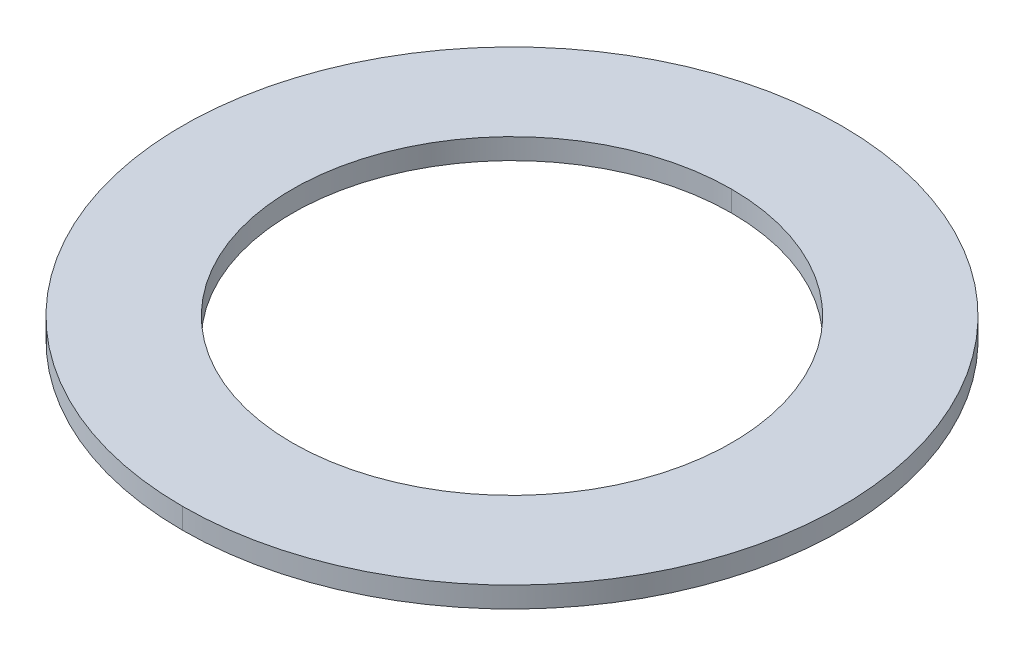
ISO-10303-21;
HEADER;
FILE_DESCRIPTION(('STEP AP214'),'2;1');
FILE_NAME('part.step','',(''),(''),'','','');
FILE_SCHEMA(('AUTOMOTIVE_DESIGN { 1 0 10303 214 1 1 1 1 }'));
ENDSEC;
DATA;
#1=APPLICATION_CONTEXT('core data for automotive mechanical design processes');
#2=APPLICATION_PROTOCOL_DEFINITION('international standard','automotive_design',2000,#1);
#3=PRODUCT_CONTEXT('',#1,'mechanical');
#4=PRODUCT('Part','Part','',(#3));
#5=PRODUCT_RELATED_PRODUCT_CATEGORY('part','',(#4));
#6=PRODUCT_DEFINITION_FORMATION('','',#4);
#7=PRODUCT_DEFINITION_CONTEXT('part definition',#1,'design');
#8=PRODUCT_DEFINITION('design','',#6,#7);
#9=PRODUCT_DEFINITION_SHAPE('','',#8);
#10=(LENGTH_UNIT() NAMED_UNIT(*) SI_UNIT(.MILLI.,.METRE.));
#11=(NAMED_UNIT(*) PLANE_ANGLE_UNIT() SI_UNIT($,.RADIAN.));
#12=(NAMED_UNIT(*) SI_UNIT($,.STERADIAN.) SOLID_ANGLE_UNIT());
#13=UNCERTAINTY_MEASURE_WITH_UNIT(LENGTH_MEASURE(1.E-05),#10,'distance_accuracy_value','');
#14=(GEOMETRIC_REPRESENTATION_CONTEXT(3) GLOBAL_UNCERTAINTY_ASSIGNED_CONTEXT((#13)) GLOBAL_UNIT_ASSIGNED_CONTEXT((#10,
#11,#12)) REPRESENTATION_CONTEXT('',''));
#15=CARTESIAN_POINT('',(0.,0.,0.));
#16=DIRECTION('',(0.,0.,1.));
#17=DIRECTION('',(1.,0.,0.));
#18=AXIS2_PLACEMENT_3D('',#15,#16,#17);
#19=CARTESIAN_POINT('',(0.,0.15,0.));
#20=DIRECTION('',(0.,-1.,0.));
#21=DIRECTION('',(0.,0.,-1.));
#22=AXIS2_PLACEMENT_3D('',#19,#20,#21);
#23=CYLINDRICAL_SURFACE('',#22,3.175);
#24=DIRECTION('',(0.,-1.,0.));
#25=VECTOR('',#24,1.);
#26=CARTESIAN_POINT('',(0.,0.15,3.175));
#27=LINE('',#26,#25);
#28=CARTESIAN_POINT('',(0.,0.15,3.175));
#29=VERTEX_POINT('',#28);
#30=CARTESIAN_POINT('',(0.,-0.15,3.175));
#31=VERTEX_POINT('',#30);
#32=EDGE_CURVE('E95',#29,#31,#27,.T.);
#33=ORIENTED_EDGE('',*,*,#32,.F.);
#34=CARTESIAN_POINT('',(0.,0.15,0.));
#35=DIRECTION('',(0.,1.,0.));
#36=DIRECTION('',(0.,0.,1.));
#37=AXIS2_PLACEMENT_3D('',#34,#35,#36);
#38=CIRCLE('',#37,3.175);
#39=CARTESIAN_POINT('',(0.,0.15,-3.175));
#40=VERTEX_POINT('',#39);
#41=EDGE_CURVE('E21',#29,#40,#38,.T.);
#42=ORIENTED_EDGE('',*,*,#41,.T.);
#43=DIRECTION('',(0.,-1.,0.));
#44=VECTOR('',#43,1.);
#45=CARTESIAN_POINT('',(0.,0.15,-3.175));
#46=LINE('',#45,#44);
#47=CARTESIAN_POINT('',(0.,-0.15,-3.175));
#48=VERTEX_POINT('',#47);
#49=EDGE_CURVE('E83',#40,#48,#46,.T.);
#50=ORIENTED_EDGE('',*,*,#49,.T.);
#51=CARTESIAN_POINT('',(0.,-0.15,0.));
#52=DIRECTION('',(0.,1.,0.));
#53=DIRECTION('',(0.,0.,1.));
#54=AXIS2_PLACEMENT_3D('',#51,#52,#53);
#55=CIRCLE('',#54,3.175);
#56=EDGE_CURVE('E11',#31,#48,#55,.T.);
#57=ORIENTED_EDGE('',*,*,#56,.F.);
#58=EDGE_LOOP('',(#33,#42,#50,#57));
#59=FACE_BOUND('',#58,.T.);
#60=ADVANCED_FACE('F17',(#59),#23,.F.);
#61=CARTESIAN_POINT('',(0.,0.15,0.));
#62=DIRECTION('',(0.,-1.,0.));
#63=DIRECTION('',(0.,0.,-1.));
#64=AXIS2_PLACEMENT_3D('',#61,#62,#63);
#65=CYLINDRICAL_SURFACE('',#64,4.7625);
#66=DIRECTION('',(0.,-1.,0.));
#67=VECTOR('',#66,1.);
#68=CARTESIAN_POINT('',(0.,0.15,4.7625));
#69=LINE('',#68,#67);
#70=CARTESIAN_POINT('',(0.,0.15,4.7625));
#71=VERTEX_POINT('',#70);
#72=CARTESIAN_POINT('',(0.,-0.15,4.7625));
#73=VERTEX_POINT('',#72);
#74=EDGE_CURVE('E69',#71,#73,#69,.T.);
#75=ORIENTED_EDGE('',*,*,#74,.F.);
#76=CARTESIAN_POINT('',(0.,0.15,0.));
#77=DIRECTION('',(0.,1.,0.));
#78=DIRECTION('',(0.,0.,1.));
#79=AXIS2_PLACEMENT_3D('',#76,#77,#78);
#80=CIRCLE('',#79,4.7625);
#81=CARTESIAN_POINT('',(0.,0.15,-4.7625));
#82=VERTEX_POINT('',#81);
#83=EDGE_CURVE('E63',#82,#71,#80,.T.);
#84=ORIENTED_EDGE('',*,*,#83,.F.);
#85=DIRECTION('',(0.,-1.,0.));
#86=VECTOR('',#85,1.);
#87=CARTESIAN_POINT('',(0.,0.15,-4.7625));
#88=LINE('',#87,#86);
#89=CARTESIAN_POINT('',(0.,-0.15,-4.7625));
#90=VERTEX_POINT('',#89);
#91=EDGE_CURVE('E66',#82,#90,#88,.T.);
#92=ORIENTED_EDGE('',*,*,#91,.T.);
#93=CARTESIAN_POINT('',(0.,-0.15,0.));
#94=DIRECTION('',(0.,1.,0.));
#95=DIRECTION('',(0.,0.,1.));
#96=AXIS2_PLACEMENT_3D('',#93,#94,#95);
#97=CIRCLE('',#96,4.7625);
#98=EDGE_CURVE('E28',#90,#73,#97,.T.);
#99=ORIENTED_EDGE('',*,*,#98,.T.);
#100=EDGE_LOOP('',(#75,#84,#92,#99));
#101=FACE_BOUND('',#100,.T.);
#102=ADVANCED_FACE('F65',(#101),#65,.T.);
#103=CARTESIAN_POINT('',(0.,-0.15,0.));
#104=DIRECTION('',(0.,1.,0.));
#105=DIRECTION('',(1.,0.,0.));
#106=AXIS2_PLACEMENT_3D('',#103,#104,#105);
#107=PLANE('',#106);
#108=CARTESIAN_POINT('',(0.,-0.15,0.));
#109=DIRECTION('',(0.,1.,0.));
#110=DIRECTION('',(0.,0.,1.));
#111=AXIS2_PLACEMENT_3D('',#108,#109,#110);
#112=CIRCLE('',#111,3.175);
#113=EDGE_CURVE('E92',#48,#31,#112,.T.);
#114=ORIENTED_EDGE('',*,*,#113,.T.);
#115=ORIENTED_EDGE('',*,*,#56,.T.);
#116=EDGE_LOOP('',(#114,#115));
#117=FACE_BOUND('',#116,.T.);
#118=ORIENTED_EDGE('',*,*,#98,.F.);
#119=CARTESIAN_POINT('',(0.,-0.15,0.));
#120=DIRECTION('',(0.,1.,0.));
#121=DIRECTION('',(0.,0.,1.));
#122=AXIS2_PLACEMENT_3D('',#119,#120,#121);
#123=CIRCLE('',#122,4.7625);
#124=EDGE_CURVE('E78',#73,#90,#123,.T.);
#125=ORIENTED_EDGE('',*,*,#124,.F.);
#126=EDGE_LOOP('',(#118,#125));
#127=FACE_BOUND('',#126,.T.);
#128=ADVANCED_FACE('F19',(#117,#127),#107,.F.);
#129=CARTESIAN_POINT('',(0.,0.15,0.));
#130=DIRECTION('',(0.,1.,0.));
#131=DIRECTION('',(1.,0.,0.));
#132=AXIS2_PLACEMENT_3D('',#129,#130,#131);
#133=PLANE('',#132);
#134=CARTESIAN_POINT('',(0.,0.15,0.));
#135=DIRECTION('',(0.,1.,0.));
#136=DIRECTION('',(0.,0.,1.));
#137=AXIS2_PLACEMENT_3D('',#134,#135,#136);
#138=CIRCLE('',#137,3.175);
#139=EDGE_CURVE('E99',#40,#29,#138,.T.);
#140=ORIENTED_EDGE('',*,*,#139,.F.);
#141=ORIENTED_EDGE('',*,*,#41,.F.);
#142=EDGE_LOOP('',(#140,#141));
#143=FACE_BOUND('',#142,.T.);
#144=ORIENTED_EDGE('',*,*,#83,.T.);
#145=CARTESIAN_POINT('',(0.,0.15,0.));
#146=DIRECTION('',(0.,1.,0.));
#147=DIRECTION('',(0.,0.,1.));
#148=AXIS2_PLACEMENT_3D('',#145,#146,#147);
#149=CIRCLE('',#148,4.7625);
#150=EDGE_CURVE('E77',#71,#82,#149,.T.);
#151=ORIENTED_EDGE('',*,*,#150,.T.);
#152=EDGE_LOOP('',(#144,#151));
#153=FACE_BOUND('',#152,.T.);
#154=ADVANCED_FACE('F81',(#143,#153),#133,.T.);
#155=CARTESIAN_POINT('',(0.,0.15,0.));
#156=DIRECTION('',(0.,-1.,0.));
#157=DIRECTION('',(0.,0.,-1.));
#158=AXIS2_PLACEMENT_3D('',#155,#156,#157);
#159=CYLINDRICAL_SURFACE('',#158,4.7625);
#160=ORIENTED_EDGE('',*,*,#150,.F.);
#161=ORIENTED_EDGE('',*,*,#74,.T.);
#162=ORIENTED_EDGE('',*,*,#124,.T.);
#163=ORIENTED_EDGE('',*,*,#91,.F.);
#164=EDGE_LOOP('',(#160,#161,#162,#163));
#165=FACE_BOUND('',#164,.T.);
#166=ADVANCED_FACE('F76',(#165),#159,.T.);
#167=CARTESIAN_POINT('',(0.,0.15,0.));
#168=DIRECTION('',(0.,-1.,0.));
#169=DIRECTION('',(0.,0.,-1.));
#170=AXIS2_PLACEMENT_3D('',#167,#168,#169);
#171=CYLINDRICAL_SURFACE('',#170,3.175);
#172=ORIENTED_EDGE('',*,*,#139,.T.);
#173=ORIENTED_EDGE('',*,*,#32,.T.);
#174=ORIENTED_EDGE('',*,*,#113,.F.);
#175=ORIENTED_EDGE('',*,*,#49,.F.);
#176=EDGE_LOOP('',(#172,#173,#174,#175));
#177=FACE_BOUND('',#176,.T.);
#178=ADVANCED_FACE('F192',(#177),#171,.F.);
#179=CLOSED_SHELL('',(#60,#102,#128,#154,#166,#178));
#180=MANIFOLD_SOLID_BREP('B1',#179);
#181=ADVANCED_BREP_SHAPE_REPRESENTATION('',(#18,#180),#14);
#182=SHAPE_DEFINITION_REPRESENTATION(#9,#181);
ENDSEC;
END-ISO-10303-21;
